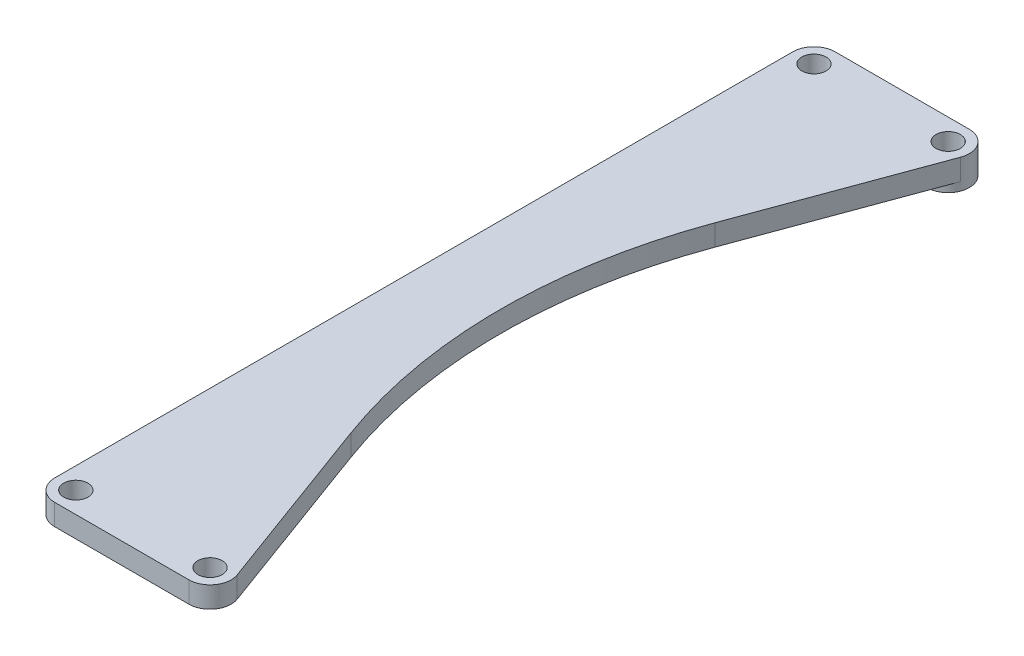
ISO-10303-21;
HEADER;
FILE_DESCRIPTION(('STEP AP214'),'2;1');
FILE_NAME('part.step','',(''),(''),'','','');
FILE_SCHEMA(('AUTOMOTIVE_DESIGN { 1 0 10303 214 1 1 1 1 }'));
ENDSEC;
DATA;
#1=APPLICATION_CONTEXT('core data for automotive mechanical design processes');
#2=APPLICATION_PROTOCOL_DEFINITION('international standard','automotive_design',2000,#1);
#3=PRODUCT_CONTEXT('',#1,'mechanical');
#4=PRODUCT('Part','Part','',(#3));
#5=PRODUCT_RELATED_PRODUCT_CATEGORY('part','',(#4));
#6=PRODUCT_DEFINITION_FORMATION('','',#4);
#7=PRODUCT_DEFINITION_CONTEXT('part definition',#1,'design');
#8=PRODUCT_DEFINITION('design','',#6,#7);
#9=PRODUCT_DEFINITION_SHAPE('','',#8);
#10=(LENGTH_UNIT() NAMED_UNIT(*) SI_UNIT(.MILLI.,.METRE.));
#11=(NAMED_UNIT(*) PLANE_ANGLE_UNIT() SI_UNIT($,.RADIAN.));
#12=(NAMED_UNIT(*) SI_UNIT($,.STERADIAN.) SOLID_ANGLE_UNIT());
#13=UNCERTAINTY_MEASURE_WITH_UNIT(LENGTH_MEASURE(1.E-05),#10,'distance_accuracy_value','');
#14=(GEOMETRIC_REPRESENTATION_CONTEXT(3) GLOBAL_UNCERTAINTY_ASSIGNED_CONTEXT((#13)) GLOBAL_UNIT_ASSIGNED_CONTEXT((#10,
#11,#12)) REPRESENTATION_CONTEXT('',''));
#15=CARTESIAN_POINT('',(0.,0.,0.));
#16=DIRECTION('',(0.,0.,1.));
#17=DIRECTION('',(1.,0.,0.));
#18=AXIS2_PLACEMENT_3D('',#15,#16,#17);
#19=CARTESIAN_POINT('',(25.4,4.,139.7));
#20=DIRECTION('',(0.,1.,0.));
#21=DIRECTION('',(0.,0.,1.));
#22=AXIS2_PLACEMENT_3D('',#19,#20,#21);
#23=PLANE('',#22);
#24=CARTESIAN_POINT('',(25.4,4.,139.7));
#25=DIRECTION('',(0.,1.,0.));
#26=DIRECTION('',(0.,0.,1.));
#27=AXIS2_PLACEMENT_3D('',#24,#25,#26);
#28=CIRCLE('',#27,2.3);
#29=CARTESIAN_POINT('',(25.4,4.,142.));
#30=VERTEX_POINT('',#29);
#31=EDGE_CURVE('E193',#30,#30,#28,.T.);
#32=ORIENTED_EDGE('',*,*,#31,.F.);
#33=EDGE_LOOP('',(#32));
#34=FACE_BOUND('',#33,.T.);
#35=CARTESIAN_POINT('',(0.,4.,0.));
#36=DIRECTION('',(0.,1.,0.));
#37=DIRECTION('',(0.,0.,1.));
#38=AXIS2_PLACEMENT_3D('',#35,#36,#37);
#39=CIRCLE('',#38,2.3);
#40=CARTESIAN_POINT('',(0.,4.,2.3));
#41=VERTEX_POINT('',#40);
#42=EDGE_CURVE('E204',#41,#41,#39,.T.);
#43=ORIENTED_EDGE('',*,*,#42,.F.);
#44=EDGE_LOOP('',(#43));
#45=FACE_BOUND('',#44,.T.);
#46=DIRECTION('',(-1.,0.,0.));
#47=VECTOR('',#46,1.);
#48=CARTESIAN_POINT('',(-4.00000000000002,4.,-4.));
#49=LINE('',#48,#47);
#50=CARTESIAN_POINT('',(25.4,4.,-4.));
#51=VERTEX_POINT('',#50);
#52=CARTESIAN_POINT('',(0.,4.,-4.));
#53=VERTEX_POINT('',#52);
#54=EDGE_CURVE('E219',#51,#53,#49,.T.);
#55=ORIENTED_EDGE('',*,*,#54,.T.);
#56=CARTESIAN_POINT('',(0.,4.,0.));
#57=DIRECTION('',(0.,1.,0.));
#58=DIRECTION('',(0.,0.,1.));
#59=AXIS2_PLACEMENT_3D('',#56,#57,#58);
#60=CIRCLE('',#59,4.);
#61=CARTESIAN_POINT('',(-4.00000000000002,4.,0.));
#62=VERTEX_POINT('',#61);
#63=EDGE_CURVE('E137',#53,#62,#60,.T.);
#64=ORIENTED_EDGE('',*,*,#63,.T.);
#65=DIRECTION('',(0.,0.,1.));
#66=VECTOR('',#65,1.);
#67=CARTESIAN_POINT('',(-3.99999999999999,4.,143.7));
#68=LINE('',#67,#66);
#69=CARTESIAN_POINT('',(-3.99999999999999,4.,139.7));
#70=VERTEX_POINT('',#69);
#71=EDGE_CURVE('E222',#62,#70,#68,.T.);
#72=ORIENTED_EDGE('',*,*,#71,.T.);
#73=CARTESIAN_POINT('',(0.,4.,139.7));
#74=DIRECTION('',(0.,1.,0.));
#75=DIRECTION('',(0.,0.,1.));
#76=AXIS2_PLACEMENT_3D('',#73,#74,#75);
#77=CIRCLE('',#76,4.);
#78=CARTESIAN_POINT('',(0.,4.,143.7));
#79=VERTEX_POINT('',#78);
#80=EDGE_CURVE('E143',#70,#79,#77,.T.);
#81=ORIENTED_EDGE('',*,*,#80,.T.);
#82=DIRECTION('',(1.,0.,0.));
#83=VECTOR('',#82,1.);
#84=CARTESIAN_POINT('',(-3.99999999999999,4.,143.7));
#85=LINE('',#84,#83);
#86=CARTESIAN_POINT('',(25.4,4.,143.7));
#87=VERTEX_POINT('',#86);
#88=EDGE_CURVE('E226',#79,#87,#85,.T.);
#89=ORIENTED_EDGE('',*,*,#88,.T.);
#90=CARTESIAN_POINT('',(25.4,4.,139.7));
#91=DIRECTION('',(0.,1.,0.));
#92=DIRECTION('',(0.,0.,1.));
#93=AXIS2_PLACEMENT_3D('',#90,#91,#92);
#94=CIRCLE('',#93,4.00000000000001);
#95=CARTESIAN_POINT('',(29.154640594373,4.,138.320625501509));
#96=VERTEX_POINT('',#95);
#97=EDGE_CURVE('E229',#87,#96,#94,.T.);
#98=ORIENTED_EDGE('',*,*,#97,.T.);
#99=DIRECTION('',(-0.344843624622696,0.,-0.938660148593239));
#100=VECTOR('',#99,1.);
#101=CARTESIAN_POINT('',(4.00000000000001,4.,69.85));
#102=LINE('',#101,#100);
#103=CARTESIAN_POINT('',(16.6688158244642,4.,104.33436246227));
#104=VERTEX_POINT('',#103);
#105=EDGE_CURVE('E209',#96,#104,#102,.T.);
#106=ORIENTED_EDGE('',*,*,#105,.T.);
#107=CARTESIAN_POINT('',(110.534830683788,4.,69.85));
#108=DIRECTION('',(0.,1.,0.));
#109=DIRECTION('',(0.,0.,1.));
#110=AXIS2_PLACEMENT_3D('',#107,#108,#109);
#111=CIRCLE('',#110,100.);
#112=CARTESIAN_POINT('',(16.6688158244641,4.,35.3656375377304));
#113=VERTEX_POINT('',#112);
#114=EDGE_CURVE('E43',#104,#113,#111,.F.);
#115=ORIENTED_EDGE('',*,*,#114,.T.);
#116=DIRECTION('',(0.344843624622696,0.,-0.938660148593239));
#117=VECTOR('',#116,1.);
#118=CARTESIAN_POINT('',(4.00000000000001,4.,69.85));
#119=LINE('',#118,#117);
#120=CARTESIAN_POINT('',(29.154640594373,4.,1.37937449849078));
#121=VERTEX_POINT('',#120);
#122=EDGE_CURVE('E212',#113,#121,#119,.T.);
#123=ORIENTED_EDGE('',*,*,#122,.T.);
#124=CARTESIAN_POINT('',(25.4,4.,0.));
#125=DIRECTION('',(0.,1.,0.));
#126=DIRECTION('',(0.,0.,1.));
#127=AXIS2_PLACEMENT_3D('',#124,#125,#126);
#128=CIRCLE('',#127,4.);
#129=EDGE_CURVE('E216',#121,#51,#128,.T.);
#130=ORIENTED_EDGE('',*,*,#129,.T.);
#131=EDGE_LOOP('',(#55,#64,#72,#81,#89,#98,#106,#115,#123,#130));
#132=FACE_BOUND('',#131,.T.);
#133=CARTESIAN_POINT('',(25.4,4.,0.));
#134=DIRECTION('',(0.,1.,0.));
#135=DIRECTION('',(0.,0.,1.));
#136=AXIS2_PLACEMENT_3D('',#133,#134,#135);
#137=CIRCLE('',#136,2.3);
#138=CARTESIAN_POINT('',(25.4,4.,2.3));
#139=VERTEX_POINT('',#138);
#140=EDGE_CURVE('E197',#139,#139,#137,.T.);
#141=ORIENTED_EDGE('',*,*,#140,.F.);
#142=EDGE_LOOP('',(#141));
#143=FACE_BOUND('',#142,.T.);
#144=CARTESIAN_POINT('',(0.,4.,139.7));
#145=DIRECTION('',(0.,1.,0.));
#146=DIRECTION('',(0.,0.,1.));
#147=AXIS2_PLACEMENT_3D('',#144,#145,#146);
#148=CIRCLE('',#147,2.30000000000137);
#149=CARTESIAN_POINT('',(0.,4.,142.000000000001));
#150=VERTEX_POINT('',#149);
#151=EDGE_CURVE('E185',#150,#150,#148,.T.);
#152=ORIENTED_EDGE('',*,*,#151,.F.);
#153=EDGE_LOOP('',(#152));
#154=FACE_BOUND('',#153,.T.);
#155=ADVANCED_FACE('F39',(#34,#45,#132,#143,#154),#23,.T.);
#156=CARTESIAN_POINT('',(25.4,0.,139.7));
#157=DIRECTION('',(0.,1.,0.));
#158=DIRECTION('',(0.,0.,1.));
#159=AXIS2_PLACEMENT_3D('',#156,#157,#158);
#160=PLANE('',#159);
#161=DIRECTION('',(0.,0.,1.));
#162=VECTOR('',#161,1.);
#163=CARTESIAN_POINT('',(-3.99999999999999,0.,143.7));
#164=LINE('',#163,#162);
#165=CARTESIAN_POINT('',(-4.,0.,0.));
#166=VERTEX_POINT('',#165);
#167=CARTESIAN_POINT('',(-3.99999999999999,0.,139.7));
#168=VERTEX_POINT('',#167);
#169=EDGE_CURVE('E239',#166,#168,#164,.T.);
#170=ORIENTED_EDGE('',*,*,#169,.F.);
#171=CARTESIAN_POINT('',(0.,0.,0.));
#172=DIRECTION('',(0.,1.,0.));
#173=DIRECTION('',(0.,0.,1.));
#174=AXIS2_PLACEMENT_3D('',#171,#172,#173);
#175=CIRCLE('',#174,4.);
#176=CARTESIAN_POINT('',(0.,0.,4.));
#177=VERTEX_POINT('',#176);
#178=EDGE_CURVE('E11',#166,#177,#175,.T.);
#179=ORIENTED_EDGE('',*,*,#178,.T.);
#180=DIRECTION('',(1.,0.,0.));
#181=VECTOR('',#180,1.);
#182=CARTESIAN_POINT('',(25.4,0.,4.));
#183=LINE('',#182,#181);
#184=CARTESIAN_POINT('',(25.4,0.,4.));
#185=VERTEX_POINT('',#184);
#186=EDGE_CURVE('E164',#177,#185,#183,.T.);
#187=ORIENTED_EDGE('',*,*,#186,.T.);
#188=CARTESIAN_POINT('',(25.4,0.,0.));
#189=DIRECTION('',(0.,1.,0.));
#190=DIRECTION('',(0.,0.,1.));
#191=AXIS2_PLACEMENT_3D('',#188,#189,#190);
#192=CIRCLE('',#191,4.);
#193=CARTESIAN_POINT('',(29.154640594373,0.,1.37937449849079));
#194=VERTEX_POINT('',#193);
#195=EDGE_CURVE('E161',#185,#194,#192,.T.);
#196=ORIENTED_EDGE('',*,*,#195,.T.);
#197=DIRECTION('',(0.344843624622696,0.,-0.938660148593239));
#198=VECTOR('',#197,1.);
#199=CARTESIAN_POINT('',(4.00000000000001,0.,69.85));
#200=LINE('',#199,#198);
#201=CARTESIAN_POINT('',(16.6688158244641,0.,35.3656375377304));
#202=VERTEX_POINT('',#201);
#203=EDGE_CURVE('E235',#202,#194,#200,.T.);
#204=ORIENTED_EDGE('',*,*,#203,.F.);
#205=CARTESIAN_POINT('',(110.534830683788,0.,69.85));
#206=DIRECTION('',(0.,1.,0.));
#207=DIRECTION('',(0.,0.,1.));
#208=AXIS2_PLACEMENT_3D('',#205,#206,#207);
#209=CIRCLE('',#208,100.);
#210=CARTESIAN_POINT('',(16.6688158244642,0.,104.33436246227));
#211=VERTEX_POINT('',#210);
#212=EDGE_CURVE('E64',#202,#211,#209,.T.);
#213=ORIENTED_EDGE('',*,*,#212,.T.);
#214=DIRECTION('',(-0.344843624622696,0.,-0.938660148593239));
#215=VECTOR('',#214,1.);
#216=CARTESIAN_POINT('',(4.00000000000001,0.,69.85));
#217=LINE('',#216,#215);
#218=CARTESIAN_POINT('',(29.154640594373,0.,138.320625501509));
#219=VERTEX_POINT('',#218);
#220=EDGE_CURVE('E208',#219,#211,#217,.T.);
#221=ORIENTED_EDGE('',*,*,#220,.F.);
#222=CARTESIAN_POINT('',(25.4,0.,139.7));
#223=DIRECTION('',(0.,1.,0.));
#224=DIRECTION('',(0.,0.,1.));
#225=AXIS2_PLACEMENT_3D('',#222,#223,#224);
#226=CIRCLE('',#225,4.00000000000001);
#227=CARTESIAN_POINT('',(25.4,0.,143.7));
#228=VERTEX_POINT('',#227);
#229=EDGE_CURVE('E213',#228,#219,#226,.T.);
#230=ORIENTED_EDGE('',*,*,#229,.F.);
#231=DIRECTION('',(1.,0.,0.));
#232=VECTOR('',#231,1.);
#233=CARTESIAN_POINT('',(-3.99999999999999,0.,143.7));
#234=LINE('',#233,#232);
#235=CARTESIAN_POINT('',(0.,0.,143.7));
#236=VERTEX_POINT('',#235);
#237=EDGE_CURVE('E243',#236,#228,#234,.T.);
#238=ORIENTED_EDGE('',*,*,#237,.F.);
#239=CARTESIAN_POINT('',(0.,0.,139.7));
#240=DIRECTION('',(0.,1.,0.));
#241=DIRECTION('',(0.,0.,1.));
#242=AXIS2_PLACEMENT_3D('',#239,#240,#241);
#243=CIRCLE('',#242,4.);
#244=EDGE_CURVE('E144',#236,#168,#243,.F.);
#245=ORIENTED_EDGE('',*,*,#244,.T.);
#246=EDGE_LOOP('',(#170,#179,#187,#196,#204,#213,#221,#230,#238,#245));
#247=FACE_BOUND('',#246,.T.);
#248=CARTESIAN_POINT('',(25.4,0.,139.7));
#249=DIRECTION('',(0.,1.,0.));
#250=DIRECTION('',(0.,0.,1.));
#251=AXIS2_PLACEMENT_3D('',#248,#249,#250);
#252=CIRCLE('',#251,2.3);
#253=CARTESIAN_POINT('',(25.4,0.,142.));
#254=VERTEX_POINT('',#253);
#255=EDGE_CURVE('E189',#254,#254,#252,.T.);
#256=ORIENTED_EDGE('',*,*,#255,.T.);
#257=EDGE_LOOP('',(#256));
#258=FACE_BOUND('',#257,.T.);
#259=CARTESIAN_POINT('',(0.,0.,139.7));
#260=DIRECTION('',(0.,1.,0.));
#261=DIRECTION('',(0.,0.,1.));
#262=AXIS2_PLACEMENT_3D('',#259,#260,#261);
#263=CIRCLE('',#262,2.30000000000137);
#264=CARTESIAN_POINT('',(0.,0.,142.000000000001));
#265=VERTEX_POINT('',#264);
#266=EDGE_CURVE('E182',#265,#265,#263,.T.);
#267=ORIENTED_EDGE('',*,*,#266,.T.);
#268=EDGE_LOOP('',(#267));
#269=FACE_BOUND('',#268,.T.);
#270=ADVANCED_FACE('F306',(#247,#258,#269),#160,.F.);
#271=CARTESIAN_POINT('',(4.00000000000001,4.,69.85));
#272=DIRECTION('',(-0.938660148593239,0.,0.344843624622696));
#273=DIRECTION('',(0.344843624622696,0.,0.938660148593239));
#274=AXIS2_PLACEMENT_3D('',#271,#272,#273);
#275=PLANE('',#274);
#276=ORIENTED_EDGE('',*,*,#220,.T.);
#277=DIRECTION('',(0.,-1.,0.));
#278=VECTOR('',#277,1.);
#279=CARTESIAN_POINT('',(16.6688158244642,4.,104.33436246227));
#280=LINE('',#279,#278);
#281=EDGE_CURVE('E56',#211,#104,#280,.F.);
#282=ORIENTED_EDGE('',*,*,#281,.T.);
#283=ORIENTED_EDGE('',*,*,#105,.F.);
#284=DIRECTION('',(0.,-1.,0.));
#285=VECTOR('',#284,1.);
#286=CARTESIAN_POINT('',(29.154640594373,4.,138.320625501509));
#287=LINE('',#286,#285);
#288=EDGE_CURVE('E232',#96,#219,#287,.T.);
#289=ORIENTED_EDGE('',*,*,#288,.T.);
#290=EDGE_LOOP('',(#276,#282,#283,#289));
#291=FACE_BOUND('',#290,.T.);
#292=ADVANCED_FACE('F314',(#291),#275,.F.);
#293=CARTESIAN_POINT('',(4.00000000000001,4.,69.85));
#294=DIRECTION('',(-0.938660148593239,0.,-0.344843624622696));
#295=DIRECTION('',(-0.344843624622696,0.,0.938660148593239));
#296=AXIS2_PLACEMENT_3D('',#293,#294,#295);
#297=PLANE('',#296);
#298=ORIENTED_EDGE('',*,*,#122,.F.);
#299=DIRECTION('',(0.,-1.,0.));
#300=VECTOR('',#299,1.);
#301=CARTESIAN_POINT('',(16.6688158244641,0.,35.3656375377304));
#302=LINE('',#301,#300);
#303=EDGE_CURVE('E278',#113,#202,#302,.T.);
#304=ORIENTED_EDGE('',*,*,#303,.T.);
#305=ORIENTED_EDGE('',*,*,#203,.T.);
#306=DIRECTION('',(0.,-1.,0.));
#307=VECTOR('',#306,1.);
#308=CARTESIAN_POINT('',(29.154640594373,4.,1.37937449849078));
#309=LINE('',#308,#307);
#310=EDGE_CURVE('E257',#121,#194,#309,.T.);
#311=ORIENTED_EDGE('',*,*,#310,.F.);
#312=EDGE_LOOP('',(#298,#304,#305,#311));
#313=FACE_BOUND('',#312,.T.);
#314=ADVANCED_FACE('F293',(#313),#297,.F.);
#315=CARTESIAN_POINT('',(25.4,4.,0.));
#316=DIRECTION('',(0.,-1.,0.));
#317=DIRECTION('',(0.,0.,-1.));
#318=AXIS2_PLACEMENT_3D('',#315,#316,#317);
#319=CYLINDRICAL_SURFACE('',#318,4.);
#320=ORIENTED_EDGE('',*,*,#310,.T.);
#321=ORIENTED_EDGE('',*,*,#195,.F.);
#322=DIRECTION('',(0.,1.,0.));
#323=VECTOR('',#322,1.);
#324=CARTESIAN_POINT('',(25.4,-1.575308,4.));
#325=LINE('',#324,#323);
#326=CARTESIAN_POINT('',(25.4,-1.575308,4.));
#327=VERTEX_POINT('',#326);
#328=EDGE_CURVE('E179',#327,#185,#325,.T.);
#329=ORIENTED_EDGE('',*,*,#328,.F.);
#330=CARTESIAN_POINT('',(25.4,-1.575308,0.));
#331=DIRECTION('',(0.,1.,0.));
#332=DIRECTION('',(0.,0.,1.));
#333=AXIS2_PLACEMENT_3D('',#330,#331,#332);
#334=CIRCLE('',#333,4.);
#335=CARTESIAN_POINT('',(25.4,-1.575308,-4.));
#336=VERTEX_POINT('',#335);
#337=EDGE_CURVE('E172',#327,#336,#334,.T.);
#338=ORIENTED_EDGE('',*,*,#337,.T.);
#339=DIRECTION('',(0.,-1.,0.));
#340=VECTOR('',#339,1.);
#341=CARTESIAN_POINT('',(25.4,4.,-4.));
#342=LINE('',#341,#340);
#343=EDGE_CURVE('E159',#51,#336,#342,.T.);
#344=ORIENTED_EDGE('',*,*,#343,.F.);
#345=ORIENTED_EDGE('',*,*,#129,.F.);
#346=EDGE_LOOP('',(#320,#321,#329,#338,#344,#345));
#347=FACE_BOUND('',#346,.T.);
#348=ADVANCED_FACE('F336',(#347),#319,.T.);
#349=CARTESIAN_POINT('',(-4.00000000000002,4.,-4.));
#350=DIRECTION('',(0.,0.,1.));
#351=DIRECTION('',(1.,0.,0.));
#352=AXIS2_PLACEMENT_3D('',#349,#350,#351);
#353=PLANE('',#352);
#354=ORIENTED_EDGE('',*,*,#343,.T.);
#355=DIRECTION('',(-1.,0.,0.));
#356=VECTOR('',#355,1.);
#357=CARTESIAN_POINT('',(25.4,-1.575308,-4.));
#358=LINE('',#357,#356);
#359=CARTESIAN_POINT('',(0.,-1.575308,-4.));
#360=VERTEX_POINT('',#359);
#361=EDGE_CURVE('E151',#336,#360,#358,.T.);
#362=ORIENTED_EDGE('',*,*,#361,.T.);
#363=DIRECTION('',(0.,-1.,0.));
#364=VECTOR('',#363,1.);
#365=CARTESIAN_POINT('',(0.,4.,-4.));
#366=LINE('',#365,#364);
#367=EDGE_CURVE('E132',#360,#53,#366,.F.);
#368=ORIENTED_EDGE('',*,*,#367,.T.);
#369=ORIENTED_EDGE('',*,*,#54,.F.);
#370=EDGE_LOOP('',(#354,#362,#368,#369));
#371=FACE_BOUND('',#370,.T.);
#372=ADVANCED_FACE('F157',(#371),#353,.F.);
#373=CARTESIAN_POINT('',(-3.99999999999999,4.,143.7));
#374=DIRECTION('',(1.,0.,0.));
#375=DIRECTION('',(0.,0.,-1.));
#376=AXIS2_PLACEMENT_3D('',#373,#374,#375);
#377=PLANE('',#376);
#378=ORIENTED_EDGE('',*,*,#71,.F.);
#379=DIRECTION('',(0.,-1.,0.));
#380=VECTOR('',#379,1.);
#381=CARTESIAN_POINT('',(-4.00000000000002,4.,0.));
#382=LINE('',#381,#380);
#383=EDGE_CURVE('E264',#62,#166,#382,.T.);
#384=ORIENTED_EDGE('',*,*,#383,.T.);
#385=ORIENTED_EDGE('',*,*,#169,.T.);
#386=DIRECTION('',(0.,-1.,0.));
#387=VECTOR('',#386,1.);
#388=CARTESIAN_POINT('',(-3.99999999999999,4.,139.7));
#389=LINE('',#388,#387);
#390=EDGE_CURVE('E261',#168,#70,#389,.F.);
#391=ORIENTED_EDGE('',*,*,#390,.T.);
#392=EDGE_LOOP('',(#378,#384,#385,#391));
#393=FACE_BOUND('',#392,.T.);
#394=ADVANCED_FACE('F329',(#393),#377,.F.);
#395=CARTESIAN_POINT('',(-3.99999999999999,4.,143.7));
#396=DIRECTION('',(0.,0.,-1.));
#397=DIRECTION('',(-1.,0.,0.));
#398=AXIS2_PLACEMENT_3D('',#395,#396,#397);
#399=PLANE('',#398);
#400=ORIENTED_EDGE('',*,*,#88,.F.);
#401=DIRECTION('',(0.,-1.,0.));
#402=VECTOR('',#401,1.);
#403=CARTESIAN_POINT('',(0.,4.,143.7));
#404=LINE('',#403,#402);
#405=EDGE_CURVE('E274',#79,#236,#404,.T.);
#406=ORIENTED_EDGE('',*,*,#405,.T.);
#407=ORIENTED_EDGE('',*,*,#237,.T.);
#408=DIRECTION('',(0.,-1.,0.));
#409=VECTOR('',#408,1.);
#410=CARTESIAN_POINT('',(25.4,4.,143.7));
#411=LINE('',#410,#409);
#412=EDGE_CURVE('E251',#87,#228,#411,.T.);
#413=ORIENTED_EDGE('',*,*,#412,.F.);
#414=EDGE_LOOP('',(#400,#406,#407,#413));
#415=FACE_BOUND('',#414,.T.);
#416=ADVANCED_FACE('F325',(#415),#399,.F.);
#417=CARTESIAN_POINT('',(25.4,4.,139.7));
#418=DIRECTION('',(0.,-1.,0.));
#419=DIRECTION('',(0.,0.,-1.));
#420=AXIS2_PLACEMENT_3D('',#417,#418,#419);
#421=CYLINDRICAL_SURFACE('',#420,4.00000000000001);
#422=ORIENTED_EDGE('',*,*,#229,.T.);
#423=ORIENTED_EDGE('',*,*,#288,.F.);
#424=ORIENTED_EDGE('',*,*,#97,.F.);
#425=ORIENTED_EDGE('',*,*,#412,.T.);
#426=EDGE_LOOP('',(#422,#423,#424,#425));
#427=FACE_BOUND('',#426,.T.);
#428=ADVANCED_FACE('F322',(#427),#421,.T.);
#429=CARTESIAN_POINT('',(0.,4.,0.));
#430=DIRECTION('',(0.,-1.,0.));
#431=DIRECTION('',(0.,0.,-1.));
#432=AXIS2_PLACEMENT_3D('',#429,#430,#431);
#433=CYLINDRICAL_SURFACE('',#432,2.3);
#434=ORIENTED_EDGE('',*,*,#42,.T.);
#435=EDGE_LOOP('',(#434));
#436=FACE_BOUND('',#435,.T.);
#437=CARTESIAN_POINT('',(0.,-1.575308,0.));
#438=DIRECTION('',(0.,1.,0.));
#439=DIRECTION('',(0.,0.,1.));
#440=AXIS2_PLACEMENT_3D('',#437,#438,#439);
#441=CIRCLE('',#440,2.3);
#442=CARTESIAN_POINT('',(0.,-1.575308,2.3));
#443=VERTEX_POINT('',#442);
#444=EDGE_CURVE('E167',#443,#443,#441,.T.);
#445=ORIENTED_EDGE('',*,*,#444,.F.);
#446=EDGE_LOOP('',(#445));
#447=FACE_BOUND('',#446,.T.);
#448=ADVANCED_FACE('F319',(#436,#447),#433,.F.);
#449=CARTESIAN_POINT('',(25.4,4.,0.));
#450=DIRECTION('',(0.,-1.,0.));
#451=DIRECTION('',(0.,0.,-1.));
#452=AXIS2_PLACEMENT_3D('',#449,#450,#451);
#453=CYLINDRICAL_SURFACE('',#452,2.3);
#454=ORIENTED_EDGE('',*,*,#140,.T.);
#455=EDGE_LOOP('',(#454));
#456=FACE_BOUND('',#455,.T.);
#457=CARTESIAN_POINT('',(25.4,-1.575308,0.));
#458=DIRECTION('',(0.,1.,0.));
#459=DIRECTION('',(0.,0.,1.));
#460=AXIS2_PLACEMENT_3D('',#457,#458,#459);
#461=CIRCLE('',#460,2.3);
#462=CARTESIAN_POINT('',(25.4,-1.575308,2.3));
#463=VERTEX_POINT('',#462);
#464=EDGE_CURVE('E369',#463,#463,#461,.T.);
#465=ORIENTED_EDGE('',*,*,#464,.F.);
#466=EDGE_LOOP('',(#465));
#467=FACE_BOUND('',#466,.T.);
#468=ADVANCED_FACE('F355',(#456,#467),#453,.F.);
#469=CARTESIAN_POINT('',(25.4,4.,139.7));
#470=DIRECTION('',(0.,-1.,0.));
#471=DIRECTION('',(0.,0.,-1.));
#472=AXIS2_PLACEMENT_3D('',#469,#470,#471);
#473=CYLINDRICAL_SURFACE('',#472,2.3);
#474=ORIENTED_EDGE('',*,*,#31,.T.);
#475=EDGE_LOOP('',(#474));
#476=FACE_BOUND('',#475,.T.);
#477=ORIENTED_EDGE('',*,*,#255,.F.);
#478=EDGE_LOOP('',(#477));
#479=FACE_BOUND('',#478,.T.);
#480=ADVANCED_FACE('F349',(#476,#479),#473,.F.);
#481=CARTESIAN_POINT('',(0.,4.,139.7));
#482=DIRECTION('',(0.,-1.,0.));
#483=DIRECTION('',(0.,0.,-1.));
#484=AXIS2_PLACEMENT_3D('',#481,#482,#483);
#485=CYLINDRICAL_SURFACE('',#484,2.30000000000137);
#486=ORIENTED_EDGE('',*,*,#151,.T.);
#487=EDGE_LOOP('',(#486));
#488=FACE_BOUND('',#487,.T.);
#489=ORIENTED_EDGE('',*,*,#266,.F.);
#490=EDGE_LOOP('',(#489));
#491=FACE_BOUND('',#490,.T.);
#492=ADVANCED_FACE('F344',(#488,#491),#485,.F.);
#493=CARTESIAN_POINT('',(0.,4.,0.));
#494=DIRECTION('',(0.,-1.,0.));
#495=DIRECTION('',(0.,0.,-1.));
#496=AXIS2_PLACEMENT_3D('',#493,#494,#495);
#497=CYLINDRICAL_SURFACE('',#496,4.);
#498=ORIENTED_EDGE('',*,*,#63,.F.);
#499=ORIENTED_EDGE('',*,*,#367,.F.);
#500=CARTESIAN_POINT('',(0.,-1.575308,0.));
#501=DIRECTION('',(0.,1.,0.));
#502=DIRECTION('',(0.,0.,1.));
#503=AXIS2_PLACEMENT_3D('',#500,#501,#502);
#504=CIRCLE('',#503,4.);
#505=CARTESIAN_POINT('',(0.,-1.575308,4.));
#506=VERTEX_POINT('',#505);
#507=EDGE_CURVE('E135',#360,#506,#504,.T.);
#508=ORIENTED_EDGE('',*,*,#507,.T.);
#509=DIRECTION('',(0.,1.,0.));
#510=VECTOR('',#509,1.);
#511=CARTESIAN_POINT('',(0.,-1.575308,4.));
#512=LINE('',#511,#510);
#513=EDGE_CURVE('E174',#506,#177,#512,.T.);
#514=ORIENTED_EDGE('',*,*,#513,.T.);
#515=ORIENTED_EDGE('',*,*,#178,.F.);
#516=ORIENTED_EDGE('',*,*,#383,.F.);
#517=EDGE_LOOP('',(#498,#499,#508,#514,#515,#516));
#518=FACE_BOUND('',#517,.T.);
#519=ADVANCED_FACE('F134',(#518),#497,.T.);
#520=CARTESIAN_POINT('',(0.,4.,139.7));
#521=DIRECTION('',(0.,-1.,0.));
#522=DIRECTION('',(0.,0.,-1.));
#523=AXIS2_PLACEMENT_3D('',#520,#521,#522);
#524=CYLINDRICAL_SURFACE('',#523,4.);
#525=ORIENTED_EDGE('',*,*,#80,.F.);
#526=ORIENTED_EDGE('',*,*,#390,.F.);
#527=ORIENTED_EDGE('',*,*,#244,.F.);
#528=ORIENTED_EDGE('',*,*,#405,.F.);
#529=EDGE_LOOP('',(#525,#526,#527,#528));
#530=FACE_BOUND('',#529,.T.);
#531=ADVANCED_FACE('F297',(#530),#524,.T.);
#532=CARTESIAN_POINT('',(110.534830683788,4.,69.85));
#533=DIRECTION('',(0.,1.,0.));
#534=DIRECTION('',(0.,0.,1.));
#535=AXIS2_PLACEMENT_3D('',#532,#533,#534);
#536=CYLINDRICAL_SURFACE('',#535,100.);
#537=ORIENTED_EDGE('',*,*,#114,.F.);
#538=ORIENTED_EDGE('',*,*,#281,.F.);
#539=ORIENTED_EDGE('',*,*,#212,.F.);
#540=ORIENTED_EDGE('',*,*,#303,.F.);
#541=EDGE_LOOP('',(#537,#538,#539,#540));
#542=FACE_BOUND('',#541,.T.);
#543=ADVANCED_FACE('F41',(#542),#536,.F.);
#544=CARTESIAN_POINT('',(25.4,-1.575308,4.));
#545=DIRECTION('',(0.,0.,1.));
#546=DIRECTION('',(1.,0.,0.));
#547=AXIS2_PLACEMENT_3D('',#544,#545,#546);
#548=PLANE('',#547);
#549=ORIENTED_EDGE('',*,*,#186,.F.);
#550=ORIENTED_EDGE('',*,*,#513,.F.);
#551=DIRECTION('',(1.,0.,0.));
#552=VECTOR('',#551,1.);
#553=CARTESIAN_POINT('',(25.4,-1.575308,4.));
#554=LINE('',#553,#552);
#555=EDGE_CURVE('E154',#506,#327,#554,.T.);
#556=ORIENTED_EDGE('',*,*,#555,.T.);
#557=ORIENTED_EDGE('',*,*,#328,.T.);
#558=EDGE_LOOP('',(#549,#550,#556,#557));
#559=FACE_BOUND('',#558,.T.);
#560=ADVANCED_FACE('F296',(#559),#548,.T.);
#561=CARTESIAN_POINT('',(0.,-1.575308,0.));
#562=DIRECTION('',(0.,1.,0.));
#563=DIRECTION('',(0.,0.,1.));
#564=AXIS2_PLACEMENT_3D('',#561,#562,#563);
#565=PLANE('',#564);
#566=ORIENTED_EDGE('',*,*,#464,.T.);
#567=EDGE_LOOP('',(#566));
#568=FACE_BOUND('',#567,.T.);
#569=ORIENTED_EDGE('',*,*,#444,.T.);
#570=EDGE_LOOP('',(#569));
#571=FACE_BOUND('',#570,.T.);
#572=ORIENTED_EDGE('',*,*,#361,.F.);
#573=ORIENTED_EDGE('',*,*,#337,.F.);
#574=ORIENTED_EDGE('',*,*,#555,.F.);
#575=ORIENTED_EDGE('',*,*,#507,.F.);
#576=EDGE_LOOP('',(#572,#573,#574,#575));
#577=FACE_BOUND('',#576,.T.);
#578=ADVANCED_FACE('F149',(#568,#571,#577),#565,.F.);
#579=CLOSED_SHELL('',(#155,#270,#292,#314,#348,#372,#394,#416,#428,#448,#468,#480,#492,#519,
#531,#543,#560,#578));
#580=MANIFOLD_SOLID_BREP('B2',#579);
#581=ADVANCED_BREP_SHAPE_REPRESENTATION('',(#18,#580),#14);
#582=SHAPE_DEFINITION_REPRESENTATION(#9,#581);
ENDSEC;
END-ISO-10303-21;
